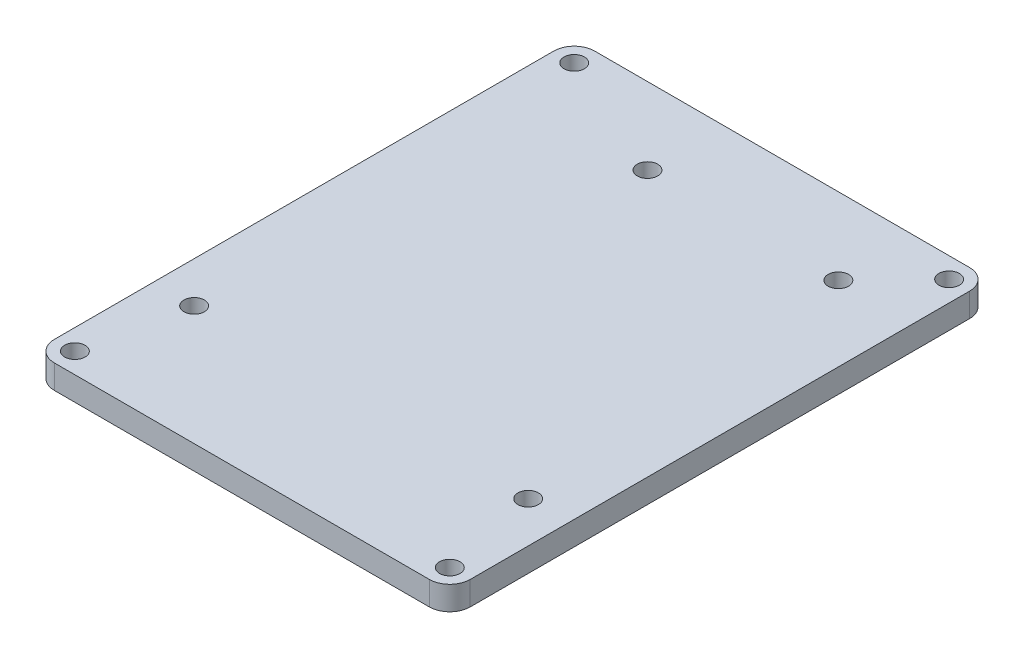
ISO-10303-21;
HEADER;
FILE_DESCRIPTION(('STEP AP214'),'2;1');
FILE_NAME('part.step','',(''),(''),'','','');
FILE_SCHEMA(('AUTOMOTIVE_DESIGN { 1 0 10303 214 1 1 1 1 }'));
ENDSEC;
DATA;
#1=APPLICATION_CONTEXT('core data for automotive mechanical design processes');
#2=APPLICATION_PROTOCOL_DEFINITION('international standard','automotive_design',2000,#1);
#3=PRODUCT_CONTEXT('',#1,'mechanical');
#4=PRODUCT('Part','Part','',(#3));
#5=PRODUCT_RELATED_PRODUCT_CATEGORY('part','',(#4));
#6=PRODUCT_DEFINITION_FORMATION('','',#4);
#7=PRODUCT_DEFINITION_CONTEXT('part definition',#1,'design');
#8=PRODUCT_DEFINITION('design','',#6,#7);
#9=PRODUCT_DEFINITION_SHAPE('','',#8);
#10=(LENGTH_UNIT() NAMED_UNIT(*) SI_UNIT(.MILLI.,.METRE.));
#11=(NAMED_UNIT(*) PLANE_ANGLE_UNIT() SI_UNIT($,.RADIAN.));
#12=(NAMED_UNIT(*) SI_UNIT($,.STERADIAN.) SOLID_ANGLE_UNIT());
#13=UNCERTAINTY_MEASURE_WITH_UNIT(LENGTH_MEASURE(1.E-05),#10,'distance_accuracy_value','');
#14=(GEOMETRIC_REPRESENTATION_CONTEXT(3) GLOBAL_UNCERTAINTY_ASSIGNED_CONTEXT((#13)) GLOBAL_UNIT_ASSIGNED_CONTEXT((#10,
#11,#12)) REPRESENTATION_CONTEXT('',''));
#15=CARTESIAN_POINT('',(0.,0.,0.));
#16=DIRECTION('',(0.,0.,1.));
#17=DIRECTION('',(1.,0.,0.));
#18=AXIS2_PLACEMENT_3D('',#15,#16,#17);
#19=CARTESIAN_POINT('',(30.5,3.5,-39.625));
#20=DIRECTION('',(-1.,0.,0.));
#21=DIRECTION('',(0.,0.,1.));
#22=AXIS2_PLACEMENT_3D('',#19,#20,#21);
#23=PLANE('',#22);
#24=DIRECTION('',(0.,0.,-1.));
#25=VECTOR('',#24,1.);
#26=CARTESIAN_POINT('',(30.5,0.,-39.625));
#27=LINE('',#26,#25);
#28=CARTESIAN_POINT('',(30.5,0.,36.625));
#29=VERTEX_POINT('',#28);
#30=CARTESIAN_POINT('',(30.5,0.,-36.625));
#31=VERTEX_POINT('',#30);
#32=EDGE_CURVE('E128',#29,#31,#27,.T.);
#33=ORIENTED_EDGE('',*,*,#32,.T.);
#34=DIRECTION('',(0.,-1.,0.));
#35=VECTOR('',#34,1.);
#36=CARTESIAN_POINT('',(30.5,3.5,-36.625));
#37=LINE('',#36,#35);
#38=CARTESIAN_POINT('',(30.5,3.5,-36.625));
#39=VERTEX_POINT('',#38);
#40=EDGE_CURVE('E151',#31,#39,#37,.F.);
#41=ORIENTED_EDGE('',*,*,#40,.T.);
#42=DIRECTION('',(0.,0.,-1.));
#43=VECTOR('',#42,1.);
#44=CARTESIAN_POINT('',(30.5,3.5,-39.625));
#45=LINE('',#44,#43);
#46=CARTESIAN_POINT('',(30.5,3.5,36.625));
#47=VERTEX_POINT('',#46);
#48=EDGE_CURVE('E126',#47,#39,#45,.T.);
#49=ORIENTED_EDGE('',*,*,#48,.F.);
#50=DIRECTION('',(0.,-1.,0.));
#51=VECTOR('',#50,1.);
#52=CARTESIAN_POINT('',(30.5,3.5,36.625));
#53=LINE('',#52,#51);
#54=EDGE_CURVE('E148',#47,#29,#53,.T.);
#55=ORIENTED_EDGE('',*,*,#54,.T.);
#56=EDGE_LOOP('',(#33,#41,#49,#55));
#57=FACE_BOUND('',#56,.T.);
#58=ADVANCED_FACE('F33',(#57),#23,.F.);
#59=CARTESIAN_POINT('',(-30.5,3.5,-39.625));
#60=DIRECTION('',(0.,0.,1.));
#61=DIRECTION('',(1.,0.,0.));
#62=AXIS2_PLACEMENT_3D('',#59,#60,#61);
#63=PLANE('',#62);
#64=DIRECTION('',(-1.,0.,0.));
#65=VECTOR('',#64,1.);
#66=CARTESIAN_POINT('',(-30.5,0.,-39.625));
#67=LINE('',#66,#65);
#68=CARTESIAN_POINT('',(27.5,0.,-39.625));
#69=VERTEX_POINT('',#68);
#70=CARTESIAN_POINT('',(-27.5,0.,-39.625));
#71=VERTEX_POINT('',#70);
#72=EDGE_CURVE('E124',#69,#71,#67,.T.);
#73=ORIENTED_EDGE('',*,*,#72,.T.);
#74=DIRECTION('',(0.,-1.,0.));
#75=VECTOR('',#74,1.);
#76=CARTESIAN_POINT('',(-27.5,3.5,-39.625));
#77=LINE('',#76,#75);
#78=CARTESIAN_POINT('',(-27.5,3.5,-39.625));
#79=VERTEX_POINT('',#78);
#80=EDGE_CURVE('E103',#71,#79,#77,.F.);
#81=ORIENTED_EDGE('',*,*,#80,.T.);
#82=DIRECTION('',(-1.,0.,0.));
#83=VECTOR('',#82,1.);
#84=CARTESIAN_POINT('',(-30.5,3.5,-39.625));
#85=LINE('',#84,#83);
#86=CARTESIAN_POINT('',(27.5,3.5,-39.625));
#87=VERTEX_POINT('',#86);
#88=EDGE_CURVE('E167',#87,#79,#85,.T.);
#89=ORIENTED_EDGE('',*,*,#88,.F.);
#90=DIRECTION('',(0.,-1.,0.));
#91=VECTOR('',#90,1.);
#92=CARTESIAN_POINT('',(27.5,3.5,-39.625));
#93=LINE('',#92,#91);
#94=EDGE_CURVE('E108',#87,#69,#93,.T.);
#95=ORIENTED_EDGE('',*,*,#94,.T.);
#96=EDGE_LOOP('',(#73,#81,#89,#95));
#97=FACE_BOUND('',#96,.T.);
#98=ADVANCED_FACE('F254',(#97),#63,.F.);
#99=CARTESIAN_POINT('',(-30.5,3.5,-39.625));
#100=DIRECTION('',(1.,0.,0.));
#101=DIRECTION('',(0.,0.,-1.));
#102=AXIS2_PLACEMENT_3D('',#99,#100,#101);
#103=PLANE('',#102);
#104=DIRECTION('',(0.,0.,1.));
#105=VECTOR('',#104,1.);
#106=CARTESIAN_POINT('',(-30.5,3.5,-39.625));
#107=LINE('',#106,#105);
#108=CARTESIAN_POINT('',(-30.5,3.5,-36.625));
#109=VERTEX_POINT('',#108);
#110=CARTESIAN_POINT('',(-30.5,3.5,36.625));
#111=VERTEX_POINT('',#110);
#112=EDGE_CURVE('E117',#109,#111,#107,.T.);
#113=ORIENTED_EDGE('',*,*,#112,.F.);
#114=DIRECTION('',(0.,-1.,0.));
#115=VECTOR('',#114,1.);
#116=CARTESIAN_POINT('',(-30.5,3.5,-36.625));
#117=LINE('',#116,#115);
#118=CARTESIAN_POINT('',(-30.5,0.,-36.625));
#119=VERTEX_POINT('',#118);
#120=EDGE_CURVE('E102',#109,#119,#117,.T.);
#121=ORIENTED_EDGE('',*,*,#120,.T.);
#122=DIRECTION('',(0.,0.,1.));
#123=VECTOR('',#122,1.);
#124=CARTESIAN_POINT('',(-30.5,0.,-39.625));
#125=LINE('',#124,#123);
#126=CARTESIAN_POINT('',(-30.5,0.,36.625));
#127=VERTEX_POINT('',#126);
#128=EDGE_CURVE('E115',#119,#127,#125,.T.);
#129=ORIENTED_EDGE('',*,*,#128,.T.);
#130=DIRECTION('',(0.,-1.,0.));
#131=VECTOR('',#130,1.);
#132=CARTESIAN_POINT('',(-30.5,3.5,36.625));
#133=LINE('',#132,#131);
#134=EDGE_CURVE('E119',#127,#111,#133,.F.);
#135=ORIENTED_EDGE('',*,*,#134,.T.);
#136=EDGE_LOOP('',(#113,#121,#129,#135));
#137=FACE_BOUND('',#136,.T.);
#138=ADVANCED_FACE('F114',(#137),#103,.F.);
#139=CARTESIAN_POINT('',(-30.5,3.5,39.625));
#140=DIRECTION('',(0.,0.,-1.));
#141=DIRECTION('',(-1.,0.,0.));
#142=AXIS2_PLACEMENT_3D('',#139,#140,#141);
#143=PLANE('',#142);
#144=DIRECTION('',(1.,0.,0.));
#145=VECTOR('',#144,1.);
#146=CARTESIAN_POINT('',(-30.5,0.,39.625));
#147=LINE('',#146,#145);
#148=CARTESIAN_POINT('',(-27.5,0.,39.625));
#149=VERTEX_POINT('',#148);
#150=CARTESIAN_POINT('',(27.5,0.,39.625));
#151=VERTEX_POINT('',#150);
#152=EDGE_CURVE('E123',#149,#151,#147,.T.);
#153=ORIENTED_EDGE('',*,*,#152,.T.);
#154=DIRECTION('',(0.,-1.,0.));
#155=VECTOR('',#154,1.);
#156=CARTESIAN_POINT('',(27.5,3.5,39.625));
#157=LINE('',#156,#155);
#158=CARTESIAN_POINT('',(27.5,3.5,39.625));
#159=VERTEX_POINT('',#158);
#160=EDGE_CURVE('E11',#151,#159,#157,.F.);
#161=ORIENTED_EDGE('',*,*,#160,.T.);
#162=DIRECTION('',(1.,0.,0.));
#163=VECTOR('',#162,1.);
#164=CARTESIAN_POINT('',(-30.5,3.5,39.625));
#165=LINE('',#164,#163);
#166=CARTESIAN_POINT('',(-27.5,3.5,39.625));
#167=VERTEX_POINT('',#166);
#168=EDGE_CURVE('E132',#167,#159,#165,.T.);
#169=ORIENTED_EDGE('',*,*,#168,.F.);
#170=DIRECTION('',(0.,-1.,0.));
#171=VECTOR('',#170,1.);
#172=CARTESIAN_POINT('',(-27.5,3.5,39.625));
#173=LINE('',#172,#171);
#174=EDGE_CURVE('E41',#167,#149,#173,.T.);
#175=ORIENTED_EDGE('',*,*,#174,.T.);
#176=EDGE_LOOP('',(#153,#161,#169,#175));
#177=FACE_BOUND('',#176,.T.);
#178=ADVANCED_FACE('F154',(#177),#143,.F.);
#179=CARTESIAN_POINT('',(0.,3.5,0.));
#180=DIRECTION('',(0.,1.,0.));
#181=DIRECTION('',(0.,0.,1.));
#182=AXIS2_PLACEMENT_3D('',#179,#180,#181);
#183=PLANE('',#182);
#184=CARTESIAN_POINT('',(-24.5,3.5,22.125));
#185=DIRECTION('',(0.,1.,0.));
#186=DIRECTION('',(0.,0.,1.));
#187=AXIS2_PLACEMENT_3D('',#184,#185,#186);
#188=CIRCLE('',#187,1.5);
#189=CARTESIAN_POINT('',(-24.5,3.5,23.625));
#190=VERTEX_POINT('',#189);
#191=EDGE_CURVE('E219',#190,#190,#188,.T.);
#192=ORIENTED_EDGE('',*,*,#191,.F.);
#193=EDGE_LOOP('',(#192));
#194=FACE_BOUND('',#193,.T.);
#195=CARTESIAN_POINT('',(24.5,3.5,22.125));
#196=DIRECTION('',(0.,1.,0.));
#197=DIRECTION('',(0.,0.,1.));
#198=AXIS2_PLACEMENT_3D('',#195,#196,#197);
#199=CIRCLE('',#198,1.5);
#200=CARTESIAN_POINT('',(24.5,3.5,23.625));
#201=VERTEX_POINT('',#200);
#202=EDGE_CURVE('E213',#201,#201,#199,.T.);
#203=ORIENTED_EDGE('',*,*,#202,.F.);
#204=EDGE_LOOP('',(#203));
#205=FACE_BOUND('',#204,.T.);
#206=CARTESIAN_POINT('',(19.5,3.5,-28.375));
#207=DIRECTION('',(0.,1.,0.));
#208=DIRECTION('',(0.,0.,1.));
#209=AXIS2_PLACEMENT_3D('',#206,#207,#208);
#210=CIRCLE('',#209,1.5);
#211=CARTESIAN_POINT('',(19.5,3.5,-26.875));
#212=VERTEX_POINT('',#211);
#213=EDGE_CURVE('E207',#212,#212,#210,.T.);
#214=ORIENTED_EDGE('',*,*,#213,.F.);
#215=EDGE_LOOP('',(#214));
#216=FACE_BOUND('',#215,.T.);
#217=CARTESIAN_POINT('',(-8.5,3.5,-28.375));
#218=DIRECTION('',(0.,1.,0.));
#219=DIRECTION('',(0.,0.,1.));
#220=AXIS2_PLACEMENT_3D('',#217,#218,#219);
#221=CIRCLE('',#220,1.5);
#222=CARTESIAN_POINT('',(-8.5,3.5,-26.875));
#223=VERTEX_POINT('',#222);
#224=EDGE_CURVE('E201',#223,#223,#221,.T.);
#225=ORIENTED_EDGE('',*,*,#224,.F.);
#226=EDGE_LOOP('',(#225));
#227=FACE_BOUND('',#226,.T.);
#228=CARTESIAN_POINT('',(27.5,3.5,-36.625));
#229=DIRECTION('',(0.,1.,0.));
#230=DIRECTION('',(0.,0.,1.));
#231=AXIS2_PLACEMENT_3D('',#228,#229,#230);
#232=CIRCLE('',#231,1.5);
#233=CARTESIAN_POINT('',(27.5,3.5,-35.125));
#234=VERTEX_POINT('',#233);
#235=EDGE_CURVE('E190',#234,#234,#232,.T.);
#236=ORIENTED_EDGE('',*,*,#235,.F.);
#237=EDGE_LOOP('',(#236));
#238=FACE_BOUND('',#237,.T.);
#239=CARTESIAN_POINT('',(-27.5,3.5,36.625));
#240=DIRECTION('',(0.,1.,0.));
#241=DIRECTION('',(0.,0.,1.));
#242=AXIS2_PLACEMENT_3D('',#239,#240,#241);
#243=CIRCLE('',#242,1.5);
#244=CARTESIAN_POINT('',(-27.5,3.5,38.125));
#245=VERTEX_POINT('',#244);
#246=EDGE_CURVE('E183',#245,#245,#243,.T.);
#247=ORIENTED_EDGE('',*,*,#246,.F.);
#248=EDGE_LOOP('',(#247));
#249=FACE_BOUND('',#248,.T.);
#250=CARTESIAN_POINT('',(27.5,3.5,36.625));
#251=DIRECTION('',(0.,1.,0.));
#252=DIRECTION('',(0.,0.,1.));
#253=AXIS2_PLACEMENT_3D('',#250,#251,#252);
#254=CIRCLE('',#253,1.5);
#255=CARTESIAN_POINT('',(27.5,3.5,38.125));
#256=VERTEX_POINT('',#255);
#257=EDGE_CURVE('E195',#256,#256,#254,.T.);
#258=ORIENTED_EDGE('',*,*,#257,.F.);
#259=EDGE_LOOP('',(#258));
#260=FACE_BOUND('',#259,.T.);
#261=CARTESIAN_POINT('',(-27.5,3.5,-36.625));
#262=DIRECTION('',(0.,1.,0.));
#263=DIRECTION('',(0.,0.,1.));
#264=AXIS2_PLACEMENT_3D('',#261,#262,#263);
#265=CIRCLE('',#264,1.5);
#266=CARTESIAN_POINT('',(-27.5,3.5,-35.125));
#267=VERTEX_POINT('',#266);
#268=EDGE_CURVE('E172',#267,#267,#265,.T.);
#269=ORIENTED_EDGE('',*,*,#268,.F.);
#270=EDGE_LOOP('',(#269));
#271=FACE_BOUND('',#270,.T.);
#272=ORIENTED_EDGE('',*,*,#88,.T.);
#273=CARTESIAN_POINT('',(-27.5,3.5,-36.625));
#274=DIRECTION('',(0.,1.,0.));
#275=DIRECTION('',(0.,0.,1.));
#276=AXIS2_PLACEMENT_3D('',#273,#274,#275);
#277=CIRCLE('',#276,3.);
#278=EDGE_CURVE('E146',#79,#109,#277,.T.);
#279=ORIENTED_EDGE('',*,*,#278,.T.);
#280=ORIENTED_EDGE('',*,*,#112,.T.);
#281=CARTESIAN_POINT('',(-27.5,3.5,36.625));
#282=DIRECTION('',(0.,1.,0.));
#283=DIRECTION('',(0.,0.,1.));
#284=AXIS2_PLACEMENT_3D('',#281,#282,#283);
#285=CIRCLE('',#284,3.);
#286=EDGE_CURVE('E53',#111,#167,#285,.T.);
#287=ORIENTED_EDGE('',*,*,#286,.T.);
#288=ORIENTED_EDGE('',*,*,#168,.T.);
#289=CARTESIAN_POINT('',(27.5,3.5,36.625));
#290=DIRECTION('',(0.,1.,0.));
#291=DIRECTION('',(0.,0.,1.));
#292=AXIS2_PLACEMENT_3D('',#289,#290,#291);
#293=CIRCLE('',#292,3.);
#294=EDGE_CURVE('E142',#159,#47,#293,.T.);
#295=ORIENTED_EDGE('',*,*,#294,.T.);
#296=ORIENTED_EDGE('',*,*,#48,.T.);
#297=CARTESIAN_POINT('',(27.5,3.5,-36.625));
#298=DIRECTION('',(0.,1.,0.));
#299=DIRECTION('',(0.,0.,1.));
#300=AXIS2_PLACEMENT_3D('',#297,#298,#299);
#301=CIRCLE('',#300,3.);
#302=EDGE_CURVE('E144',#39,#87,#301,.T.);
#303=ORIENTED_EDGE('',*,*,#302,.T.);
#304=EDGE_LOOP('',(#272,#279,#280,#287,#288,#295,#296,#303));
#305=FACE_BOUND('',#304,.T.);
#306=ADVANCED_FACE('F234',(#194,#205,#216,#227,#238,#249,#260,#271,#305),#183,.T.);
#307=CARTESIAN_POINT('',(0.,0.,0.));
#308=DIRECTION('',(0.,1.,0.));
#309=DIRECTION('',(0.,0.,1.));
#310=AXIS2_PLACEMENT_3D('',#307,#308,#309);
#311=PLANE('',#310);
#312=CARTESIAN_POINT('',(-24.5,0.,22.125));
#313=DIRECTION('',(0.,1.,0.));
#314=DIRECTION('',(0.,0.,1.));
#315=AXIS2_PLACEMENT_3D('',#312,#313,#314);
#316=CIRCLE('',#315,1.5);
#317=CARTESIAN_POINT('',(-24.5,0.,23.625));
#318=VERTEX_POINT('',#317);
#319=EDGE_CURVE('E198',#318,#318,#316,.T.);
#320=ORIENTED_EDGE('',*,*,#319,.T.);
#321=EDGE_LOOP('',(#320));
#322=FACE_BOUND('',#321,.T.);
#323=CARTESIAN_POINT('',(24.5,0.,22.125));
#324=DIRECTION('',(0.,1.,0.));
#325=DIRECTION('',(0.,0.,1.));
#326=AXIS2_PLACEMENT_3D('',#323,#324,#325);
#327=CIRCLE('',#326,1.5);
#328=CARTESIAN_POINT('',(24.5,0.,23.625));
#329=VERTEX_POINT('',#328);
#330=EDGE_CURVE('E216',#329,#329,#327,.T.);
#331=ORIENTED_EDGE('',*,*,#330,.T.);
#332=EDGE_LOOP('',(#331));
#333=FACE_BOUND('',#332,.T.);
#334=CARTESIAN_POINT('',(19.5,0.,-28.375));
#335=DIRECTION('',(0.,1.,0.));
#336=DIRECTION('',(0.,0.,1.));
#337=AXIS2_PLACEMENT_3D('',#334,#335,#336);
#338=CIRCLE('',#337,1.5);
#339=CARTESIAN_POINT('',(19.5,0.,-26.875));
#340=VERTEX_POINT('',#339);
#341=EDGE_CURVE('E210',#340,#340,#338,.T.);
#342=ORIENTED_EDGE('',*,*,#341,.T.);
#343=EDGE_LOOP('',(#342));
#344=FACE_BOUND('',#343,.T.);
#345=CARTESIAN_POINT('',(-8.5,0.,-28.375));
#346=DIRECTION('',(0.,1.,0.));
#347=DIRECTION('',(0.,0.,1.));
#348=AXIS2_PLACEMENT_3D('',#345,#346,#347);
#349=CIRCLE('',#348,1.5);
#350=CARTESIAN_POINT('',(-8.5,0.,-26.875));
#351=VERTEX_POINT('',#350);
#352=EDGE_CURVE('E204',#351,#351,#349,.T.);
#353=ORIENTED_EDGE('',*,*,#352,.T.);
#354=EDGE_LOOP('',(#353));
#355=FACE_BOUND('',#354,.T.);
#356=CARTESIAN_POINT('',(27.5,0.,-36.625));
#357=DIRECTION('',(0.,1.,0.));
#358=DIRECTION('',(0.,0.,1.));
#359=AXIS2_PLACEMENT_3D('',#356,#357,#358);
#360=CIRCLE('',#359,1.5);
#361=CARTESIAN_POINT('',(27.5,0.,-35.125));
#362=VERTEX_POINT('',#361);
#363=EDGE_CURVE('E181',#362,#362,#360,.T.);
#364=ORIENTED_EDGE('',*,*,#363,.T.);
#365=EDGE_LOOP('',(#364));
#366=FACE_BOUND('',#365,.T.);
#367=CARTESIAN_POINT('',(-27.5,0.,36.625));
#368=DIRECTION('',(0.,1.,0.));
#369=DIRECTION('',(0.,0.,1.));
#370=AXIS2_PLACEMENT_3D('',#367,#368,#369);
#371=CIRCLE('',#370,1.5);
#372=CARTESIAN_POINT('',(-27.5,0.,38.125));
#373=VERTEX_POINT('',#372);
#374=EDGE_CURVE('E186',#373,#373,#371,.T.);
#375=ORIENTED_EDGE('',*,*,#374,.T.);
#376=EDGE_LOOP('',(#375));
#377=FACE_BOUND('',#376,.T.);
#378=CARTESIAN_POINT('',(27.5,0.,36.625));
#379=DIRECTION('',(0.,1.,0.));
#380=DIRECTION('',(0.,0.,1.));
#381=AXIS2_PLACEMENT_3D('',#378,#379,#380);
#382=CIRCLE('',#381,1.5);
#383=CARTESIAN_POINT('',(27.5,0.,38.125));
#384=VERTEX_POINT('',#383);
#385=EDGE_CURVE('E187',#384,#384,#382,.T.);
#386=ORIENTED_EDGE('',*,*,#385,.T.);
#387=EDGE_LOOP('',(#386));
#388=FACE_BOUND('',#387,.T.);
#389=CARTESIAN_POINT('',(-27.5,0.,-36.625));
#390=DIRECTION('',(0.,1.,0.));
#391=DIRECTION('',(0.,0.,1.));
#392=AXIS2_PLACEMENT_3D('',#389,#390,#391);
#393=CIRCLE('',#392,1.5);
#394=CARTESIAN_POINT('',(-27.5,0.,-35.125));
#395=VERTEX_POINT('',#394);
#396=EDGE_CURVE('E176',#395,#395,#393,.T.);
#397=ORIENTED_EDGE('',*,*,#396,.T.);
#398=EDGE_LOOP('',(#397));
#399=FACE_BOUND('',#398,.T.);
#400=ORIENTED_EDGE('',*,*,#128,.F.);
#401=CARTESIAN_POINT('',(-27.5,0.,-36.625));
#402=DIRECTION('',(0.,1.,0.));
#403=DIRECTION('',(0.,0.,1.));
#404=AXIS2_PLACEMENT_3D('',#401,#402,#403);
#405=CIRCLE('',#404,3.);
#406=EDGE_CURVE('E98',#119,#71,#405,.F.);
#407=ORIENTED_EDGE('',*,*,#406,.T.);
#408=ORIENTED_EDGE('',*,*,#72,.F.);
#409=CARTESIAN_POINT('',(27.5,0.,-36.625));
#410=DIRECTION('',(0.,1.,0.));
#411=DIRECTION('',(0.,0.,1.));
#412=AXIS2_PLACEMENT_3D('',#409,#410,#411);
#413=CIRCLE('',#412,3.);
#414=EDGE_CURVE('E109',#69,#31,#413,.F.);
#415=ORIENTED_EDGE('',*,*,#414,.T.);
#416=ORIENTED_EDGE('',*,*,#32,.F.);
#417=CARTESIAN_POINT('',(27.5,0.,36.625));
#418=DIRECTION('',(0.,1.,0.));
#419=DIRECTION('',(0.,0.,1.));
#420=AXIS2_PLACEMENT_3D('',#417,#418,#419);
#421=CIRCLE('',#420,3.);
#422=EDGE_CURVE('E135',#29,#151,#421,.F.);
#423=ORIENTED_EDGE('',*,*,#422,.T.);
#424=ORIENTED_EDGE('',*,*,#152,.F.);
#425=CARTESIAN_POINT('',(-27.5,0.,36.625));
#426=DIRECTION('',(0.,1.,0.));
#427=DIRECTION('',(0.,0.,1.));
#428=AXIS2_PLACEMENT_3D('',#425,#426,#427);
#429=CIRCLE('',#428,3.);
#430=EDGE_CURVE('E118',#149,#127,#429,.F.);
#431=ORIENTED_EDGE('',*,*,#430,.T.);
#432=EDGE_LOOP('',(#400,#407,#408,#415,#416,#423,#424,#431));
#433=FACE_BOUND('',#432,.T.);
#434=ADVANCED_FACE('F121',(#322,#333,#344,#355,#366,#377,#388,#399,#433),#311,.F.);
#435=CARTESIAN_POINT('',(-27.5,0.,-36.625));
#436=DIRECTION('',(0.,1.,0.));
#437=DIRECTION('',(0.,0.,1.));
#438=AXIS2_PLACEMENT_3D('',#435,#436,#437);
#439=CYLINDRICAL_SURFACE('',#438,1.5);
#440=ORIENTED_EDGE('',*,*,#396,.F.);
#441=EDGE_LOOP('',(#440));
#442=FACE_BOUND('',#441,.T.);
#443=ORIENTED_EDGE('',*,*,#268,.T.);
#444=EDGE_LOOP('',(#443));
#445=FACE_BOUND('',#444,.T.);
#446=ADVANCED_FACE('F277',(#442,#445),#439,.F.);
#447=CARTESIAN_POINT('',(27.5,0.,36.625));
#448=DIRECTION('',(0.,1.,0.));
#449=DIRECTION('',(0.,0.,1.));
#450=AXIS2_PLACEMENT_3D('',#447,#448,#449);
#451=CYLINDRICAL_SURFACE('',#450,1.5);
#452=ORIENTED_EDGE('',*,*,#385,.F.);
#453=EDGE_LOOP('',(#452));
#454=FACE_BOUND('',#453,.T.);
#455=ORIENTED_EDGE('',*,*,#257,.T.);
#456=EDGE_LOOP('',(#455));
#457=FACE_BOUND('',#456,.T.);
#458=ADVANCED_FACE('F281',(#454,#457),#451,.F.);
#459=CARTESIAN_POINT('',(-27.5,0.,36.625));
#460=DIRECTION('',(0.,1.,0.));
#461=DIRECTION('',(0.,0.,1.));
#462=AXIS2_PLACEMENT_3D('',#459,#460,#461);
#463=CYLINDRICAL_SURFACE('',#462,1.5);
#464=ORIENTED_EDGE('',*,*,#374,.F.);
#465=EDGE_LOOP('',(#464));
#466=FACE_BOUND('',#465,.T.);
#467=ORIENTED_EDGE('',*,*,#246,.T.);
#468=EDGE_LOOP('',(#467));
#469=FACE_BOUND('',#468,.T.);
#470=ADVANCED_FACE('F283',(#466,#469),#463,.F.);
#471=CARTESIAN_POINT('',(27.5,0.,-36.625));
#472=DIRECTION('',(0.,1.,0.));
#473=DIRECTION('',(0.,0.,1.));
#474=AXIS2_PLACEMENT_3D('',#471,#472,#473);
#475=CYLINDRICAL_SURFACE('',#474,1.5);
#476=ORIENTED_EDGE('',*,*,#363,.F.);
#477=EDGE_LOOP('',(#476));
#478=FACE_BOUND('',#477,.T.);
#479=ORIENTED_EDGE('',*,*,#235,.T.);
#480=EDGE_LOOP('',(#479));
#481=FACE_BOUND('',#480,.T.);
#482=ADVANCED_FACE('F263',(#478,#481),#475,.F.);
#483=CARTESIAN_POINT('',(-27.5,3.5,-36.625));
#484=DIRECTION('',(0.,-1.,0.));
#485=DIRECTION('',(0.,0.,-1.));
#486=AXIS2_PLACEMENT_3D('',#483,#484,#485);
#487=CYLINDRICAL_SURFACE('',#486,3.);
#488=ORIENTED_EDGE('',*,*,#278,.F.);
#489=ORIENTED_EDGE('',*,*,#80,.F.);
#490=ORIENTED_EDGE('',*,*,#406,.F.);
#491=ORIENTED_EDGE('',*,*,#120,.F.);
#492=EDGE_LOOP('',(#488,#489,#490,#491));
#493=FACE_BOUND('',#492,.T.);
#494=ADVANCED_FACE('F101',(#493),#487,.T.);
#495=CARTESIAN_POINT('',(27.5,3.5,-36.625));
#496=DIRECTION('',(0.,-1.,0.));
#497=DIRECTION('',(0.,0.,-1.));
#498=AXIS2_PLACEMENT_3D('',#495,#496,#497);
#499=CYLINDRICAL_SURFACE('',#498,3.);
#500=ORIENTED_EDGE('',*,*,#302,.F.);
#501=ORIENTED_EDGE('',*,*,#40,.F.);
#502=ORIENTED_EDGE('',*,*,#414,.F.);
#503=ORIENTED_EDGE('',*,*,#94,.F.);
#504=EDGE_LOOP('',(#500,#501,#502,#503));
#505=FACE_BOUND('',#504,.T.);
#506=ADVANCED_FACE('F256',(#505),#499,.T.);
#507=CARTESIAN_POINT('',(27.5,3.5,36.625));
#508=DIRECTION('',(0.,-1.,0.));
#509=DIRECTION('',(0.,0.,-1.));
#510=AXIS2_PLACEMENT_3D('',#507,#508,#509);
#511=CYLINDRICAL_SURFACE('',#510,3.);
#512=ORIENTED_EDGE('',*,*,#294,.F.);
#513=ORIENTED_EDGE('',*,*,#160,.F.);
#514=ORIENTED_EDGE('',*,*,#422,.F.);
#515=ORIENTED_EDGE('',*,*,#54,.F.);
#516=EDGE_LOOP('',(#512,#513,#514,#515));
#517=FACE_BOUND('',#516,.T.);
#518=ADVANCED_FACE('F161',(#517),#511,.T.);
#519=CARTESIAN_POINT('',(-27.5,3.5,36.625));
#520=DIRECTION('',(0.,-1.,0.));
#521=DIRECTION('',(0.,0.,-1.));
#522=AXIS2_PLACEMENT_3D('',#519,#520,#521);
#523=CYLINDRICAL_SURFACE('',#522,3.);
#524=ORIENTED_EDGE('',*,*,#286,.F.);
#525=ORIENTED_EDGE('',*,*,#134,.F.);
#526=ORIENTED_EDGE('',*,*,#430,.F.);
#527=ORIENTED_EDGE('',*,*,#174,.F.);
#528=EDGE_LOOP('',(#524,#525,#526,#527));
#529=FACE_BOUND('',#528,.T.);
#530=ADVANCED_FACE('F35',(#529),#523,.T.);
#531=CARTESIAN_POINT('',(-8.5,0.,-28.375));
#532=DIRECTION('',(0.,1.,0.));
#533=DIRECTION('',(0.,0.,1.));
#534=AXIS2_PLACEMENT_3D('',#531,#532,#533);
#535=CYLINDRICAL_SURFACE('',#534,1.5);
#536=ORIENTED_EDGE('',*,*,#352,.F.);
#537=EDGE_LOOP('',(#536));
#538=FACE_BOUND('',#537,.T.);
#539=ORIENTED_EDGE('',*,*,#224,.T.);
#540=EDGE_LOOP('',(#539));
#541=FACE_BOUND('',#540,.T.);
#542=ADVANCED_FACE('F293',(#538,#541),#535,.F.);
#543=CARTESIAN_POINT('',(19.5,0.,-28.375));
#544=DIRECTION('',(0.,1.,0.));
#545=DIRECTION('',(0.,0.,1.));
#546=AXIS2_PLACEMENT_3D('',#543,#544,#545);
#547=CYLINDRICAL_SURFACE('',#546,1.5);
#548=ORIENTED_EDGE('',*,*,#341,.F.);
#549=EDGE_LOOP('',(#548));
#550=FACE_BOUND('',#549,.T.);
#551=ORIENTED_EDGE('',*,*,#213,.T.);
#552=EDGE_LOOP('',(#551));
#553=FACE_BOUND('',#552,.T.);
#554=ADVANCED_FACE('F296',(#550,#553),#547,.F.);
#555=CARTESIAN_POINT('',(24.5,0.,22.125));
#556=DIRECTION('',(0.,1.,0.));
#557=DIRECTION('',(0.,0.,1.));
#558=AXIS2_PLACEMENT_3D('',#555,#556,#557);
#559=CYLINDRICAL_SURFACE('',#558,1.5);
#560=ORIENTED_EDGE('',*,*,#330,.F.);
#561=EDGE_LOOP('',(#560));
#562=FACE_BOUND('',#561,.T.);
#563=ORIENTED_EDGE('',*,*,#202,.T.);
#564=EDGE_LOOP('',(#563));
#565=FACE_BOUND('',#564,.T.);
#566=ADVANCED_FACE('F230',(#562,#565),#559,.F.);
#567=CARTESIAN_POINT('',(-24.5,0.,22.125));
#568=DIRECTION('',(0.,1.,0.));
#569=DIRECTION('',(0.,0.,1.));
#570=AXIS2_PLACEMENT_3D('',#567,#568,#569);
#571=CYLINDRICAL_SURFACE('',#570,1.5);
#572=ORIENTED_EDGE('',*,*,#319,.F.);
#573=EDGE_LOOP('',(#572));
#574=FACE_BOUND('',#573,.T.);
#575=ORIENTED_EDGE('',*,*,#191,.T.);
#576=EDGE_LOOP('',(#575));
#577=FACE_BOUND('',#576,.T.);
#578=ADVANCED_FACE('F227',(#574,#577),#571,.F.);
#579=CLOSED_SHELL('',(#58,#98,#138,#178,#306,#434,#446,#458,#470,#482,#494,#506,#518,#530,#542,
#554,#566,#578));
#580=MANIFOLD_SOLID_BREP('B2',#579);
#581=ADVANCED_BREP_SHAPE_REPRESENTATION('',(#18,#580),#14);
#582=SHAPE_DEFINITION_REPRESENTATION(#9,#581);
ENDSEC;
END-ISO-10303-21;
